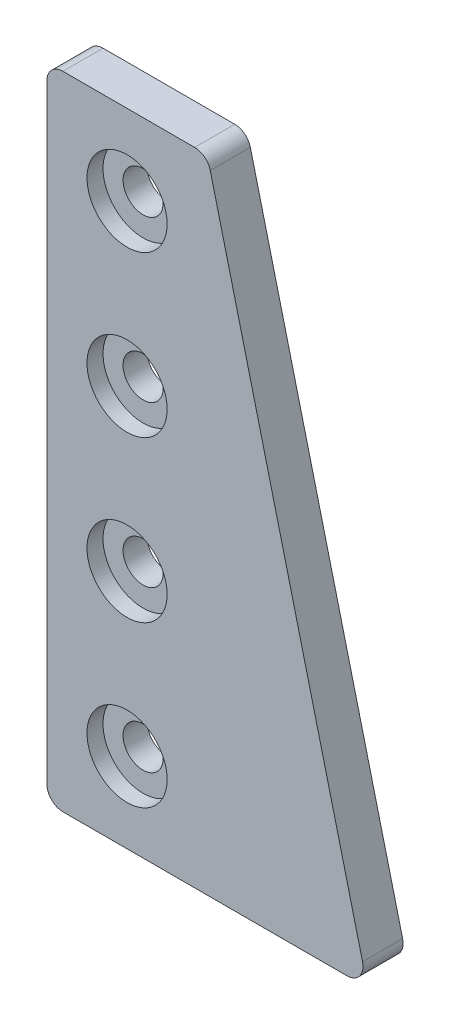
ISO-10303-21;
HEADER;
FILE_DESCRIPTION(('STEP AP214'),'2;1');
FILE_NAME('part.step','',(''),(''),'','','');
FILE_SCHEMA(('AUTOMOTIVE_DESIGN { 1 0 10303 214 1 1 1 1 }'));
ENDSEC;
DATA;
#1=APPLICATION_CONTEXT('core data for automotive mechanical design processes');
#2=APPLICATION_PROTOCOL_DEFINITION('international standard','automotive_design',2000,#1);
#3=PRODUCT_CONTEXT('',#1,'mechanical');
#4=PRODUCT('Part','Part','',(#3));
#5=PRODUCT_RELATED_PRODUCT_CATEGORY('part','',(#4));
#6=PRODUCT_DEFINITION_FORMATION('','',#4);
#7=PRODUCT_DEFINITION_CONTEXT('part definition',#1,'design');
#8=PRODUCT_DEFINITION('design','',#6,#7);
#9=PRODUCT_DEFINITION_SHAPE('','',#8);
#10=(LENGTH_UNIT() NAMED_UNIT(*) SI_UNIT(.MILLI.,.METRE.));
#11=(NAMED_UNIT(*) PLANE_ANGLE_UNIT() SI_UNIT($,.RADIAN.));
#12=(NAMED_UNIT(*) SI_UNIT($,.STERADIAN.) SOLID_ANGLE_UNIT());
#13=UNCERTAINTY_MEASURE_WITH_UNIT(LENGTH_MEASURE(1.E-05),#10,'distance_accuracy_value','');
#14=(GEOMETRIC_REPRESENTATION_CONTEXT(3) GLOBAL_UNCERTAINTY_ASSIGNED_CONTEXT((#13)) GLOBAL_UNIT_ASSIGNED_CONTEXT((#10,
#11,#12)) REPRESENTATION_CONTEXT('',''));
#15=CARTESIAN_POINT('',(0.,0.,0.));
#16=DIRECTION('',(0.,0.,1.));
#17=DIRECTION('',(1.,0.,0.));
#18=AXIS2_PLACEMENT_3D('',#15,#16,#17);
#19=CARTESIAN_POINT('',(10.,10.,-5.));
#20=DIRECTION('',(0.,0.,1.));
#21=DIRECTION('',(1.,0.,0.));
#22=AXIS2_PLACEMENT_3D('',#19,#20,#21);
#23=CYLINDRICAL_SURFACE('',#22,2.5);
#24=CARTESIAN_POINT('',(10.,10.,0.));
#25=DIRECTION('',(0.,0.,-1.));
#26=DIRECTION('',(-1.,0.,0.));
#27=AXIS2_PLACEMENT_3D('',#24,#25,#26);
#28=CIRCLE('',#27,2.5);
#29=CARTESIAN_POINT('',(7.50000000000001,10.,0.));
#30=VERTEX_POINT('',#29);
#31=EDGE_CURVE('E151',#30,#30,#28,.T.);
#32=ORIENTED_EDGE('',*,*,#31,.T.);
#33=EDGE_LOOP('',(#32));
#34=FACE_BOUND('',#33,.T.);
#35=CARTESIAN_POINT('',(10.,10.,3.));
#36=DIRECTION('',(0.,0.,1.));
#37=DIRECTION('',(1.,0.,0.));
#38=AXIS2_PLACEMENT_3D('',#35,#36,#37);
#39=CIRCLE('',#38,2.5);
#40=CARTESIAN_POINT('',(12.5,10.,3.));
#41=VERTEX_POINT('',#40);
#42=EDGE_CURVE('E155',#41,#41,#39,.F.);
#43=ORIENTED_EDGE('',*,*,#42,.F.);
#44=EDGE_LOOP('',(#43));
#45=FACE_BOUND('',#44,.T.);
#46=ADVANCED_FACE('F43',(#34,#45),#23,.F.);
#47=CARTESIAN_POINT('',(10.,30.,-5.));
#48=DIRECTION('',(0.,0.,1.));
#49=DIRECTION('',(1.,0.,0.));
#50=AXIS2_PLACEMENT_3D('',#47,#48,#49);
#51=CYLINDRICAL_SURFACE('',#50,2.5);
#52=CARTESIAN_POINT('',(10.,30.,0.));
#53=DIRECTION('',(0.,0.,-1.));
#54=DIRECTION('',(-1.,0.,0.));
#55=AXIS2_PLACEMENT_3D('',#52,#53,#54);
#56=CIRCLE('',#55,2.5);
#57=CARTESIAN_POINT('',(7.5,30.,0.));
#58=VERTEX_POINT('',#57);
#59=EDGE_CURVE('E154',#58,#58,#56,.T.);
#60=ORIENTED_EDGE('',*,*,#59,.T.);
#61=EDGE_LOOP('',(#60));
#62=FACE_BOUND('',#61,.T.);
#63=CARTESIAN_POINT('',(10.,30.,3.));
#64=DIRECTION('',(0.,0.,1.));
#65=DIRECTION('',(1.,0.,0.));
#66=AXIS2_PLACEMENT_3D('',#63,#64,#65);
#67=CIRCLE('',#66,2.5);
#68=CARTESIAN_POINT('',(12.5,30.,3.));
#69=VERTEX_POINT('',#68);
#70=EDGE_CURVE('E167',#69,#69,#67,.F.);
#71=ORIENTED_EDGE('',*,*,#70,.F.);
#72=EDGE_LOOP('',(#71));
#73=FACE_BOUND('',#72,.T.);
#74=ADVANCED_FACE('F264',(#62,#73),#51,.F.);
#75=CARTESIAN_POINT('',(10.,50.,-5.));
#76=DIRECTION('',(0.,0.,1.));
#77=DIRECTION('',(1.,0.,0.));
#78=AXIS2_PLACEMENT_3D('',#75,#76,#77);
#79=CYLINDRICAL_SURFACE('',#78,2.5);
#80=CARTESIAN_POINT('',(10.,50.,0.));
#81=DIRECTION('',(0.,0.,-1.));
#82=DIRECTION('',(-1.,0.,0.));
#83=AXIS2_PLACEMENT_3D('',#80,#81,#82);
#84=CIRCLE('',#83,2.5);
#85=CARTESIAN_POINT('',(7.5,50.,0.));
#86=VERTEX_POINT('',#85);
#87=EDGE_CURVE('E142',#86,#86,#84,.T.);
#88=ORIENTED_EDGE('',*,*,#87,.T.);
#89=EDGE_LOOP('',(#88));
#90=FACE_BOUND('',#89,.T.);
#91=CARTESIAN_POINT('',(10.,50.,3.));
#92=DIRECTION('',(0.,0.,1.));
#93=DIRECTION('',(1.,0.,0.));
#94=AXIS2_PLACEMENT_3D('',#91,#92,#93);
#95=CIRCLE('',#94,2.5);
#96=CARTESIAN_POINT('',(12.5,50.,3.));
#97=VERTEX_POINT('',#96);
#98=EDGE_CURVE('E163',#97,#97,#95,.F.);
#99=ORIENTED_EDGE('',*,*,#98,.F.);
#100=EDGE_LOOP('',(#99));
#101=FACE_BOUND('',#100,.T.);
#102=ADVANCED_FACE('F270',(#90,#101),#79,.F.);
#103=CARTESIAN_POINT('',(10.,70.,-5.));
#104=DIRECTION('',(0.,0.,1.));
#105=DIRECTION('',(1.,0.,0.));
#106=AXIS2_PLACEMENT_3D('',#103,#104,#105);
#107=CYLINDRICAL_SURFACE('',#106,2.5);
#108=CARTESIAN_POINT('',(10.,70.,0.));
#109=DIRECTION('',(0.,0.,-1.));
#110=DIRECTION('',(-1.,0.,0.));
#111=AXIS2_PLACEMENT_3D('',#108,#109,#110);
#112=CIRCLE('',#111,2.5);
#113=CARTESIAN_POINT('',(7.5,70.,0.));
#114=VERTEX_POINT('',#113);
#115=EDGE_CURVE('E136',#114,#114,#112,.T.);
#116=ORIENTED_EDGE('',*,*,#115,.T.);
#117=EDGE_LOOP('',(#116));
#118=FACE_BOUND('',#117,.T.);
#119=CARTESIAN_POINT('',(10.,70.,3.));
#120=DIRECTION('',(0.,0.,1.));
#121=DIRECTION('',(1.,0.,0.));
#122=AXIS2_PLACEMENT_3D('',#119,#120,#121);
#123=CIRCLE('',#122,2.5);
#124=CARTESIAN_POINT('',(12.5,70.,3.));
#125=VERTEX_POINT('',#124);
#126=EDGE_CURVE('E160',#125,#125,#123,.F.);
#127=ORIENTED_EDGE('',*,*,#126,.F.);
#128=EDGE_LOOP('',(#127));
#129=FACE_BOUND('',#128,.T.);
#130=ADVANCED_FACE('F287',(#118,#129),#107,.F.);
#131=CARTESIAN_POINT('',(40.,0.,5.));
#132=DIRECTION('',(0.,1.,0.));
#133=DIRECTION('',(-1.,0.,0.));
#134=AXIS2_PLACEMENT_3D('',#131,#132,#133);
#135=PLANE('',#134);
#136=DIRECTION('',(1.,0.,0.));
#137=VECTOR('',#136,1.);
#138=CARTESIAN_POINT('',(40.,0.,5.));
#139=LINE('',#138,#137);
#140=CARTESIAN_POINT('',(2.,0.,5.));
#141=VERTEX_POINT('',#140);
#142=CARTESIAN_POINT('',(37.4384471871912,0.,5.));
#143=VERTEX_POINT('',#142);
#144=EDGE_CURVE('E129',#141,#143,#139,.T.);
#145=ORIENTED_EDGE('',*,*,#144,.F.);
#146=DIRECTION('',(0.,0.,-1.));
#147=VECTOR('',#146,1.);
#148=CARTESIAN_POINT('',(2.,0.,5.));
#149=LINE('',#148,#147);
#150=CARTESIAN_POINT('',(2.,0.,0.));
#151=VERTEX_POINT('',#150);
#152=EDGE_CURVE('E113',#141,#151,#149,.T.);
#153=ORIENTED_EDGE('',*,*,#152,.T.);
#154=DIRECTION('',(1.,0.,0.));
#155=VECTOR('',#154,1.);
#156=CARTESIAN_POINT('',(40.,0.,0.));
#157=LINE('',#156,#155);
#158=CARTESIAN_POINT('',(37.4384471871912,0.,0.));
#159=VERTEX_POINT('',#158);
#160=EDGE_CURVE('E126',#151,#159,#157,.T.);
#161=ORIENTED_EDGE('',*,*,#160,.T.);
#162=DIRECTION('',(0.,0.,-1.));
#163=VECTOR('',#162,1.);
#164=CARTESIAN_POINT('',(37.4384471871912,0.,5.));
#165=LINE('',#164,#163);
#166=EDGE_CURVE('E131',#159,#143,#165,.F.);
#167=ORIENTED_EDGE('',*,*,#166,.T.);
#168=EDGE_LOOP('',(#145,#153,#161,#167));
#169=FACE_BOUND('',#168,.T.);
#170=ADVANCED_FACE('F125',(#169),#135,.F.);
#171=CARTESIAN_POINT('',(20.,80.,5.));
#172=DIRECTION('',(-0.970142500145332,-0.242535625036333,0.));
#173=DIRECTION('',(0.242535625036333,-0.970142500145332,0.));
#174=AXIS2_PLACEMENT_3D('',#171,#172,#173);
#175=PLANE('',#174);
#176=DIRECTION('',(-0.242535625036333,0.970142500145332,0.));
#177=VECTOR('',#176,1.);
#178=CARTESIAN_POINT('',(20.,80.,5.));
#179=LINE('',#178,#177);
#180=CARTESIAN_POINT('',(39.3787321874818,2.48507125007266,5.));
#181=VERTEX_POINT('',#180);
#182=CARTESIAN_POINT('',(20.3787321874818,78.4850712500727,5.));
#183=VERTEX_POINT('',#182);
#184=EDGE_CURVE('E196',#181,#183,#179,.T.);
#185=ORIENTED_EDGE('',*,*,#184,.F.);
#186=DIRECTION('',(0.,0.,-1.));
#187=VECTOR('',#186,1.);
#188=CARTESIAN_POINT('',(39.3787321874818,2.48507125007265,5.));
#189=LINE('',#188,#187);
#190=CARTESIAN_POINT('',(39.3787321874818,2.48507125007266,0.));
#191=VERTEX_POINT('',#190);
#192=EDGE_CURVE('E189',#181,#191,#189,.T.);
#193=ORIENTED_EDGE('',*,*,#192,.T.);
#194=DIRECTION('',(-0.242535625036333,0.970142500145332,0.));
#195=VECTOR('',#194,1.);
#196=CARTESIAN_POINT('',(20.,80.,0.));
#197=LINE('',#196,#195);
#198=CARTESIAN_POINT('',(20.3787321874818,78.4850712500727,0.));
#199=VERTEX_POINT('',#198);
#200=EDGE_CURVE('E135',#191,#199,#197,.T.);
#201=ORIENTED_EDGE('',*,*,#200,.T.);
#202=DIRECTION('',(0.,0.,-1.));
#203=VECTOR('',#202,1.);
#204=CARTESIAN_POINT('',(20.3787321874818,78.4850712500727,5.));
#205=LINE('',#204,#203);
#206=EDGE_CURVE('E187',#199,#183,#205,.F.);
#207=ORIENTED_EDGE('',*,*,#206,.T.);
#208=EDGE_LOOP('',(#185,#193,#201,#207));
#209=FACE_BOUND('',#208,.T.);
#210=ADVANCED_FACE('F194',(#209),#175,.F.);
#211=CARTESIAN_POINT('',(0.,80.,5.));
#212=DIRECTION('',(0.,-1.,0.));
#213=DIRECTION('',(0.,0.,-1.));
#214=AXIS2_PLACEMENT_3D('',#211,#212,#213);
#215=PLANE('',#214);
#216=DIRECTION('',(-1.,0.,0.));
#217=VECTOR('',#216,1.);
#218=CARTESIAN_POINT('',(0.,80.,5.));
#219=LINE('',#218,#217);
#220=CARTESIAN_POINT('',(18.4384471871912,80.,5.));
#221=VERTEX_POINT('',#220);
#222=CARTESIAN_POINT('',(2.,80.,5.));
#223=VERTEX_POINT('',#222);
#224=EDGE_CURVE('E204',#221,#223,#219,.T.);
#225=ORIENTED_EDGE('',*,*,#224,.F.);
#226=DIRECTION('',(0.,0.,-1.));
#227=VECTOR('',#226,1.);
#228=CARTESIAN_POINT('',(18.4384471871912,80.,5.));
#229=LINE('',#228,#227);
#230=CARTESIAN_POINT('',(18.4384471871912,80.,0.));
#231=VERTEX_POINT('',#230);
#232=EDGE_CURVE('E11',#221,#231,#229,.T.);
#233=ORIENTED_EDGE('',*,*,#232,.T.);
#234=DIRECTION('',(-1.,0.,0.));
#235=VECTOR('',#234,1.);
#236=CARTESIAN_POINT('',(0.,80.,0.));
#237=LINE('',#236,#235);
#238=CARTESIAN_POINT('',(2.,80.,0.));
#239=VERTEX_POINT('',#238);
#240=EDGE_CURVE('E139',#231,#239,#237,.T.);
#241=ORIENTED_EDGE('',*,*,#240,.T.);
#242=DIRECTION('',(0.,0.,-1.));
#243=VECTOR('',#242,1.);
#244=CARTESIAN_POINT('',(2.,80.,5.));
#245=LINE('',#244,#243);
#246=EDGE_CURVE('E51',#239,#223,#245,.F.);
#247=ORIENTED_EDGE('',*,*,#246,.T.);
#248=EDGE_LOOP('',(#225,#233,#241,#247));
#249=FACE_BOUND('',#248,.T.);
#250=ADVANCED_FACE('F203',(#249),#215,.F.);
#251=CARTESIAN_POINT('',(0.,0.,5.));
#252=DIRECTION('',(1.,0.,0.));
#253=DIRECTION('',(0.,0.,-1.));
#254=AXIS2_PLACEMENT_3D('',#251,#252,#253);
#255=PLANE('',#254);
#256=DIRECTION('',(0.,-1.,0.));
#257=VECTOR('',#256,1.);
#258=CARTESIAN_POINT('',(0.,0.,0.));
#259=LINE('',#258,#257);
#260=CARTESIAN_POINT('',(0.,78.,0.));
#261=VERTEX_POINT('',#260);
#262=CARTESIAN_POINT('',(0.,2.,0.));
#263=VERTEX_POINT('',#262);
#264=EDGE_CURVE('E149',#261,#263,#259,.T.);
#265=ORIENTED_EDGE('',*,*,#264,.T.);
#266=DIRECTION('',(0.,0.,-1.));
#267=VECTOR('',#266,1.);
#268=CARTESIAN_POINT('',(0.,2.,5.));
#269=LINE('',#268,#267);
#270=CARTESIAN_POINT('',(0.,2.,5.));
#271=VERTEX_POINT('',#270);
#272=EDGE_CURVE('E114',#263,#271,#269,.F.);
#273=ORIENTED_EDGE('',*,*,#272,.T.);
#274=DIRECTION('',(0.,-1.,0.));
#275=VECTOR('',#274,1.);
#276=CARTESIAN_POINT('',(0.,0.,5.));
#277=LINE('',#276,#275);
#278=CARTESIAN_POINT('',(0.,78.,5.));
#279=VERTEX_POINT('',#278);
#280=EDGE_CURVE('E145',#279,#271,#277,.T.);
#281=ORIENTED_EDGE('',*,*,#280,.F.);
#282=DIRECTION('',(0.,0.,-1.));
#283=VECTOR('',#282,1.);
#284=CARTESIAN_POINT('',(0.,78.,5.));
#285=LINE('',#284,#283);
#286=EDGE_CURVE('E119',#279,#261,#285,.T.);
#287=ORIENTED_EDGE('',*,*,#286,.T.);
#288=EDGE_LOOP('',(#265,#273,#281,#287));
#289=FACE_BOUND('',#288,.T.);
#290=ADVANCED_FACE('F247',(#289),#255,.F.);
#291=CARTESIAN_POINT('',(0.,0.,5.));
#292=DIRECTION('',(0.,0.,-1.));
#293=DIRECTION('',(-1.,0.,0.));
#294=AXIS2_PLACEMENT_3D('',#291,#292,#293);
#295=PLANE('',#294);
#296=CARTESIAN_POINT('',(10.,70.,5.));
#297=DIRECTION('',(0.,0.,1.));
#298=DIRECTION('',(1.,0.,0.));
#299=AXIS2_PLACEMENT_3D('',#296,#297,#298);
#300=CIRCLE('',#299,5.);
#301=CARTESIAN_POINT('',(15.,70.,5.));
#302=VERTEX_POINT('',#301);
#303=EDGE_CURVE('E228',#302,#302,#300,.T.);
#304=ORIENTED_EDGE('',*,*,#303,.F.);
#305=EDGE_LOOP('',(#304));
#306=FACE_BOUND('',#305,.T.);
#307=CARTESIAN_POINT('',(10.,50.,5.));
#308=DIRECTION('',(0.,0.,1.));
#309=DIRECTION('',(1.,0.,0.));
#310=AXIS2_PLACEMENT_3D('',#307,#308,#309);
#311=CIRCLE('',#310,5.);
#312=CARTESIAN_POINT('',(15.,50.,5.));
#313=VERTEX_POINT('',#312);
#314=EDGE_CURVE('E222',#313,#313,#311,.T.);
#315=ORIENTED_EDGE('',*,*,#314,.F.);
#316=EDGE_LOOP('',(#315));
#317=FACE_BOUND('',#316,.T.);
#318=CARTESIAN_POINT('',(10.,30.,5.));
#319=DIRECTION('',(0.,0.,1.));
#320=DIRECTION('',(1.,0.,0.));
#321=AXIS2_PLACEMENT_3D('',#318,#319,#320);
#322=CIRCLE('',#321,5.);
#323=CARTESIAN_POINT('',(15.,30.,5.));
#324=VERTEX_POINT('',#323);
#325=EDGE_CURVE('E216',#324,#324,#322,.T.);
#326=ORIENTED_EDGE('',*,*,#325,.F.);
#327=EDGE_LOOP('',(#326));
#328=FACE_BOUND('',#327,.T.);
#329=CARTESIAN_POINT('',(10.,10.,5.));
#330=DIRECTION('',(0.,0.,1.));
#331=DIRECTION('',(1.,0.,0.));
#332=AXIS2_PLACEMENT_3D('',#329,#330,#331);
#333=CIRCLE('',#332,5.);
#334=CARTESIAN_POINT('',(15.,10.,5.));
#335=VERTEX_POINT('',#334);
#336=EDGE_CURVE('E210',#335,#335,#333,.T.);
#337=ORIENTED_EDGE('',*,*,#336,.F.);
#338=EDGE_LOOP('',(#337));
#339=FACE_BOUND('',#338,.T.);
#340=ORIENTED_EDGE('',*,*,#280,.T.);
#341=CARTESIAN_POINT('',(2.,2.,5.));
#342=DIRECTION('',(0.,0.,-1.));
#343=DIRECTION('',(-1.,0.,0.));
#344=AXIS2_PLACEMENT_3D('',#341,#342,#343);
#345=CIRCLE('',#344,2.);
#346=EDGE_CURVE('E185',#271,#141,#345,.F.);
#347=ORIENTED_EDGE('',*,*,#346,.T.);
#348=ORIENTED_EDGE('',*,*,#144,.T.);
#349=CARTESIAN_POINT('',(37.4384471871912,1.99999999999999,5.));
#350=DIRECTION('',(0.,0.,-1.));
#351=DIRECTION('',(-1.,0.,0.));
#352=AXIS2_PLACEMENT_3D('',#349,#350,#351);
#353=CIRCLE('',#352,2.);
#354=EDGE_CURVE('E183',#143,#181,#353,.F.);
#355=ORIENTED_EDGE('',*,*,#354,.T.);
#356=ORIENTED_EDGE('',*,*,#184,.T.);
#357=CARTESIAN_POINT('',(18.4384471871912,78.,5.));
#358=DIRECTION('',(0.,0.,-1.));
#359=DIRECTION('',(-1.,0.,0.));
#360=AXIS2_PLACEMENT_3D('',#357,#358,#359);
#361=CIRCLE('',#360,2.);
#362=EDGE_CURVE('E64',#183,#221,#361,.F.);
#363=ORIENTED_EDGE('',*,*,#362,.T.);
#364=ORIENTED_EDGE('',*,*,#224,.T.);
#365=CARTESIAN_POINT('',(2.,78.,5.));
#366=DIRECTION('',(0.,0.,-1.));
#367=DIRECTION('',(-1.,0.,0.));
#368=AXIS2_PLACEMENT_3D('',#365,#366,#367);
#369=CIRCLE('',#368,2.);
#370=EDGE_CURVE('E180',#223,#279,#369,.F.);
#371=ORIENTED_EDGE('',*,*,#370,.T.);
#372=EDGE_LOOP('',(#340,#347,#348,#355,#356,#363,#364,#371));
#373=FACE_BOUND('',#372,.T.);
#374=ADVANCED_FACE('F244',(#306,#317,#328,#339,#373),#295,.F.);
#375=CARTESIAN_POINT('',(0.,0.,0.));
#376=DIRECTION('',(0.,0.,-1.));
#377=DIRECTION('',(-1.,0.,0.));
#378=AXIS2_PLACEMENT_3D('',#375,#376,#377);
#379=PLANE('',#378);
#380=ORIENTED_EDGE('',*,*,#115,.F.);
#381=EDGE_LOOP('',(#380));
#382=FACE_BOUND('',#381,.T.);
#383=ORIENTED_EDGE('',*,*,#87,.F.);
#384=EDGE_LOOP('',(#383));
#385=FACE_BOUND('',#384,.T.);
#386=ORIENTED_EDGE('',*,*,#59,.F.);
#387=EDGE_LOOP('',(#386));
#388=FACE_BOUND('',#387,.T.);
#389=ORIENTED_EDGE('',*,*,#31,.F.);
#390=EDGE_LOOP('',(#389));
#391=FACE_BOUND('',#390,.T.);
#392=ORIENTED_EDGE('',*,*,#160,.F.);
#393=CARTESIAN_POINT('',(2.,2.,0.));
#394=DIRECTION('',(0.,0.,-1.));
#395=DIRECTION('',(-1.,0.,0.));
#396=AXIS2_PLACEMENT_3D('',#393,#394,#395);
#397=CIRCLE('',#396,2.);
#398=EDGE_CURVE('E109',#151,#263,#397,.T.);
#399=ORIENTED_EDGE('',*,*,#398,.T.);
#400=ORIENTED_EDGE('',*,*,#264,.F.);
#401=CARTESIAN_POINT('',(2.,78.,0.));
#402=DIRECTION('',(0.,0.,-1.));
#403=DIRECTION('',(-1.,0.,0.));
#404=AXIS2_PLACEMENT_3D('',#401,#402,#403);
#405=CIRCLE('',#404,2.);
#406=EDGE_CURVE('E130',#261,#239,#405,.T.);
#407=ORIENTED_EDGE('',*,*,#406,.T.);
#408=ORIENTED_EDGE('',*,*,#240,.F.);
#409=CARTESIAN_POINT('',(18.4384471871912,78.,0.));
#410=DIRECTION('',(0.,0.,-1.));
#411=DIRECTION('',(-1.,0.,0.));
#412=AXIS2_PLACEMENT_3D('',#409,#410,#411);
#413=CIRCLE('',#412,2.);
#414=EDGE_CURVE('E174',#231,#199,#413,.T.);
#415=ORIENTED_EDGE('',*,*,#414,.T.);
#416=ORIENTED_EDGE('',*,*,#200,.F.);
#417=CARTESIAN_POINT('',(37.4384471871912,1.99999999999999,0.));
#418=DIRECTION('',(0.,0.,-1.));
#419=DIRECTION('',(-1.,0.,0.));
#420=AXIS2_PLACEMENT_3D('',#417,#418,#419);
#421=CIRCLE('',#420,2.);
#422=EDGE_CURVE('E120',#191,#159,#421,.T.);
#423=ORIENTED_EDGE('',*,*,#422,.T.);
#424=EDGE_LOOP('',(#392,#399,#400,#407,#408,#415,#416,#423));
#425=FACE_BOUND('',#424,.T.);
#426=ADVANCED_FACE('F133',(#382,#385,#388,#391,#425),#379,.T.);
#427=CARTESIAN_POINT('',(10.,70.,3.));
#428=DIRECTION('',(0.,0.,1.));
#429=DIRECTION('',(1.,0.,0.));
#430=AXIS2_PLACEMENT_3D('',#427,#428,#429);
#431=PLANE('',#430);
#432=CARTESIAN_POINT('',(10.,70.,3.));
#433=DIRECTION('',(0.,0.,1.));
#434=DIRECTION('',(1.,0.,0.));
#435=AXIS2_PLACEMENT_3D('',#432,#433,#434);
#436=CIRCLE('',#435,5.);
#437=CARTESIAN_POINT('',(15.,70.,3.));
#438=VERTEX_POINT('',#437);
#439=EDGE_CURVE('E164',#438,#438,#436,.T.);
#440=ORIENTED_EDGE('',*,*,#439,.T.);
#441=EDGE_LOOP('',(#440));
#442=FACE_BOUND('',#441,.T.);
#443=ORIENTED_EDGE('',*,*,#126,.T.);
#444=EDGE_LOOP('',(#443));
#445=FACE_BOUND('',#444,.T.);
#446=ADVANCED_FACE('F234',(#442,#445),#431,.T.);
#447=CARTESIAN_POINT('',(10.,70.,3.));
#448=DIRECTION('',(0.,0.,1.));
#449=DIRECTION('',(1.,0.,0.));
#450=AXIS2_PLACEMENT_3D('',#447,#448,#449);
#451=CYLINDRICAL_SURFACE('',#450,5.);
#452=ORIENTED_EDGE('',*,*,#439,.F.);
#453=EDGE_LOOP('',(#452));
#454=FACE_BOUND('',#453,.T.);
#455=ORIENTED_EDGE('',*,*,#303,.T.);
#456=EDGE_LOOP('',(#455));
#457=FACE_BOUND('',#456,.T.);
#458=ADVANCED_FACE('F237',(#454,#457),#451,.F.);
#459=CARTESIAN_POINT('',(10.,50.,3.));
#460=DIRECTION('',(0.,0.,1.));
#461=DIRECTION('',(1.,0.,0.));
#462=AXIS2_PLACEMENT_3D('',#459,#460,#461);
#463=PLANE('',#462);
#464=CARTESIAN_POINT('',(10.,50.,3.));
#465=DIRECTION('',(0.,0.,1.));
#466=DIRECTION('',(1.,0.,0.));
#467=AXIS2_PLACEMENT_3D('',#464,#465,#466);
#468=CIRCLE('',#467,5.);
#469=CARTESIAN_POINT('',(15.,50.,3.));
#470=VERTEX_POINT('',#469);
#471=EDGE_CURVE('E225',#470,#470,#468,.T.);
#472=ORIENTED_EDGE('',*,*,#471,.T.);
#473=EDGE_LOOP('',(#472));
#474=FACE_BOUND('',#473,.T.);
#475=ORIENTED_EDGE('',*,*,#98,.T.);
#476=EDGE_LOOP('',(#475));
#477=FACE_BOUND('',#476,.T.);
#478=ADVANCED_FACE('F240',(#474,#477),#463,.T.);
#479=CARTESIAN_POINT('',(10.,50.,3.));
#480=DIRECTION('',(0.,0.,1.));
#481=DIRECTION('',(1.,0.,0.));
#482=AXIS2_PLACEMENT_3D('',#479,#480,#481);
#483=CYLINDRICAL_SURFACE('',#482,5.);
#484=ORIENTED_EDGE('',*,*,#471,.F.);
#485=EDGE_LOOP('',(#484));
#486=FACE_BOUND('',#485,.T.);
#487=ORIENTED_EDGE('',*,*,#314,.T.);
#488=EDGE_LOOP('',(#487));
#489=FACE_BOUND('',#488,.T.);
#490=ADVANCED_FACE('F349',(#486,#489),#483,.F.);
#491=CARTESIAN_POINT('',(10.,30.,3.));
#492=DIRECTION('',(0.,0.,1.));
#493=DIRECTION('',(1.,0.,0.));
#494=AXIS2_PLACEMENT_3D('',#491,#492,#493);
#495=PLANE('',#494);
#496=CARTESIAN_POINT('',(10.,30.,3.));
#497=DIRECTION('',(0.,0.,1.));
#498=DIRECTION('',(1.,0.,0.));
#499=AXIS2_PLACEMENT_3D('',#496,#497,#498);
#500=CIRCLE('',#499,5.);
#501=CARTESIAN_POINT('',(15.,30.,3.));
#502=VERTEX_POINT('',#501);
#503=EDGE_CURVE('E219',#502,#502,#500,.T.);
#504=ORIENTED_EDGE('',*,*,#503,.T.);
#505=EDGE_LOOP('',(#504));
#506=FACE_BOUND('',#505,.T.);
#507=ORIENTED_EDGE('',*,*,#70,.T.);
#508=EDGE_LOOP('',(#507));
#509=FACE_BOUND('',#508,.T.);
#510=ADVANCED_FACE('F340',(#506,#509),#495,.T.);
#511=CARTESIAN_POINT('',(10.,30.,3.));
#512=DIRECTION('',(0.,0.,1.));
#513=DIRECTION('',(1.,0.,0.));
#514=AXIS2_PLACEMENT_3D('',#511,#512,#513);
#515=CYLINDRICAL_SURFACE('',#514,5.);
#516=ORIENTED_EDGE('',*,*,#503,.F.);
#517=EDGE_LOOP('',(#516));
#518=FACE_BOUND('',#517,.T.);
#519=ORIENTED_EDGE('',*,*,#325,.T.);
#520=EDGE_LOOP('',(#519));
#521=FACE_BOUND('',#520,.T.);
#522=ADVANCED_FACE('F331',(#518,#521),#515,.F.);
#523=CARTESIAN_POINT('',(10.,10.,3.));
#524=DIRECTION('',(0.,0.,1.));
#525=DIRECTION('',(1.,0.,0.));
#526=AXIS2_PLACEMENT_3D('',#523,#524,#525);
#527=PLANE('',#526);
#528=CARTESIAN_POINT('',(10.,10.,3.));
#529=DIRECTION('',(0.,0.,1.));
#530=DIRECTION('',(1.,0.,0.));
#531=AXIS2_PLACEMENT_3D('',#528,#529,#530);
#532=CIRCLE('',#531,5.);
#533=CARTESIAN_POINT('',(15.,10.,3.));
#534=VERTEX_POINT('',#533);
#535=EDGE_CURVE('E213',#534,#534,#532,.T.);
#536=ORIENTED_EDGE('',*,*,#535,.T.);
#537=EDGE_LOOP('',(#536));
#538=FACE_BOUND('',#537,.T.);
#539=ORIENTED_EDGE('',*,*,#42,.T.);
#540=EDGE_LOOP('',(#539));
#541=FACE_BOUND('',#540,.T.);
#542=ADVANCED_FACE('F321',(#538,#541),#527,.T.);
#543=CARTESIAN_POINT('',(10.,10.,3.));
#544=DIRECTION('',(0.,0.,1.));
#545=DIRECTION('',(1.,0.,0.));
#546=AXIS2_PLACEMENT_3D('',#543,#544,#545);
#547=CYLINDRICAL_SURFACE('',#546,5.);
#548=ORIENTED_EDGE('',*,*,#535,.F.);
#549=EDGE_LOOP('',(#548));
#550=FACE_BOUND('',#549,.T.);
#551=ORIENTED_EDGE('',*,*,#336,.T.);
#552=EDGE_LOOP('',(#551));
#553=FACE_BOUND('',#552,.T.);
#554=ADVANCED_FACE('F290',(#550,#553),#547,.F.);
#555=CARTESIAN_POINT('',(2.,2.,5.));
#556=DIRECTION('',(0.,0.,-1.));
#557=DIRECTION('',(-1.,0.,0.));
#558=AXIS2_PLACEMENT_3D('',#555,#556,#557);
#559=CYLINDRICAL_SURFACE('',#558,2.);
#560=ORIENTED_EDGE('',*,*,#346,.F.);
#561=ORIENTED_EDGE('',*,*,#272,.F.);
#562=ORIENTED_EDGE('',*,*,#398,.F.);
#563=ORIENTED_EDGE('',*,*,#152,.F.);
#564=EDGE_LOOP('',(#560,#561,#562,#563));
#565=FACE_BOUND('',#564,.T.);
#566=ADVANCED_FACE('F112',(#565),#559,.T.);
#567=CARTESIAN_POINT('',(37.4384471871912,1.99999999999999,5.));
#568=DIRECTION('',(0.,0.,-1.));
#569=DIRECTION('',(-1.,0.,0.));
#570=AXIS2_PLACEMENT_3D('',#567,#568,#569);
#571=CYLINDRICAL_SURFACE('',#570,2.);
#572=ORIENTED_EDGE('',*,*,#354,.F.);
#573=ORIENTED_EDGE('',*,*,#166,.F.);
#574=ORIENTED_EDGE('',*,*,#422,.F.);
#575=ORIENTED_EDGE('',*,*,#192,.F.);
#576=EDGE_LOOP('',(#572,#573,#574,#575));
#577=FACE_BOUND('',#576,.T.);
#578=ADVANCED_FACE('F262',(#577),#571,.T.);
#579=CARTESIAN_POINT('',(18.4384471871912,78.,5.));
#580=DIRECTION('',(0.,0.,-1.));
#581=DIRECTION('',(-1.,0.,0.));
#582=AXIS2_PLACEMENT_3D('',#579,#580,#581);
#583=CYLINDRICAL_SURFACE('',#582,2.);
#584=ORIENTED_EDGE('',*,*,#362,.F.);
#585=ORIENTED_EDGE('',*,*,#206,.F.);
#586=ORIENTED_EDGE('',*,*,#414,.F.);
#587=ORIENTED_EDGE('',*,*,#232,.F.);
#588=EDGE_LOOP('',(#584,#585,#586,#587));
#589=FACE_BOUND('',#588,.T.);
#590=ADVANCED_FACE('F202',(#589),#583,.T.);
#591=CARTESIAN_POINT('',(2.,78.,5.));
#592=DIRECTION('',(0.,0.,-1.));
#593=DIRECTION('',(-1.,0.,0.));
#594=AXIS2_PLACEMENT_3D('',#591,#592,#593);
#595=CYLINDRICAL_SURFACE('',#594,2.);
#596=ORIENTED_EDGE('',*,*,#370,.F.);
#597=ORIENTED_EDGE('',*,*,#246,.F.);
#598=ORIENTED_EDGE('',*,*,#406,.F.);
#599=ORIENTED_EDGE('',*,*,#286,.F.);
#600=EDGE_LOOP('',(#596,#597,#598,#599));
#601=FACE_BOUND('',#600,.T.);
#602=ADVANCED_FACE('F45',(#601),#595,.T.);
#603=CLOSED_SHELL('',(#46,#74,#102,#130,#170,#210,#250,#290,#374,#426,#446,#458,#478,#490,#510,
#522,#542,#554,#566,#578,#590,#602));
#604=MANIFOLD_SOLID_BREP('B2',#603);
#605=ADVANCED_BREP_SHAPE_REPRESENTATION('',(#18,#604),#14);
#606=SHAPE_DEFINITION_REPRESENTATION(#9,#605);
ENDSEC;
END-ISO-10303-21;
